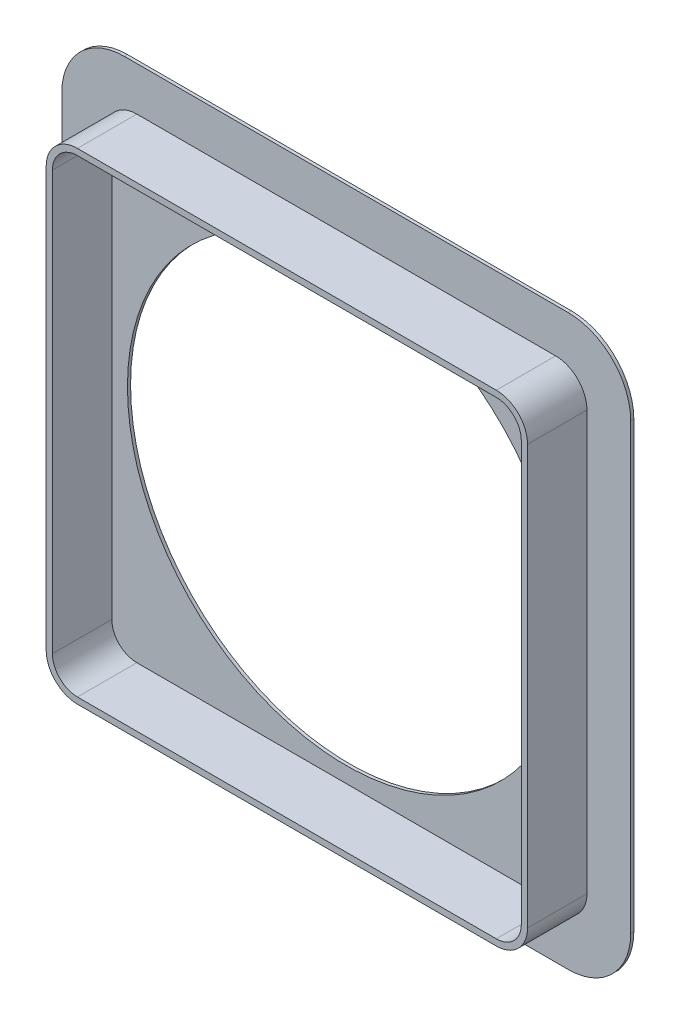
ISO-10303-21;
HEADER;
FILE_DESCRIPTION(('STEP AP214'),'2;1');
FILE_NAME('part.step','',(''),(''),'','','');
FILE_SCHEMA(('AUTOMOTIVE_DESIGN { 1 0 10303 214 1 1 1 1 }'));
ENDSEC;
DATA;
#1=APPLICATION_CONTEXT('core data for automotive mechanical design processes');
#2=APPLICATION_PROTOCOL_DEFINITION('international standard','automotive_design',2000,#1);
#3=PRODUCT_CONTEXT('',#1,'mechanical');
#4=PRODUCT('Part','Part','',(#3));
#5=PRODUCT_RELATED_PRODUCT_CATEGORY('part','',(#4));
#6=PRODUCT_DEFINITION_FORMATION('','',#4);
#7=PRODUCT_DEFINITION_CONTEXT('part definition',#1,'design');
#8=PRODUCT_DEFINITION('design','',#6,#7);
#9=PRODUCT_DEFINITION_SHAPE('','',#8);
#10=(LENGTH_UNIT() NAMED_UNIT(*) SI_UNIT(.MILLI.,.METRE.));
#11=(NAMED_UNIT(*) PLANE_ANGLE_UNIT() SI_UNIT($,.RADIAN.));
#12=(NAMED_UNIT(*) SI_UNIT($,.STERADIAN.) SOLID_ANGLE_UNIT());
#13=UNCERTAINTY_MEASURE_WITH_UNIT(LENGTH_MEASURE(1.E-05),#10,'distance_accuracy_value','');
#14=(GEOMETRIC_REPRESENTATION_CONTEXT(3) GLOBAL_UNCERTAINTY_ASSIGNED_CONTEXT((#13)) GLOBAL_UNIT_ASSIGNED_CONTEXT((#10,
#11,#12)) REPRESENTATION_CONTEXT('',''));
#15=CARTESIAN_POINT('',(0.,0.,0.));
#16=DIRECTION('',(0.,0.,1.));
#17=DIRECTION('',(1.,0.,0.));
#18=AXIS2_PLACEMENT_3D('',#15,#16,#17);
#19=CARTESIAN_POINT('',(-33.5,-33.5,0.));
#20=DIRECTION('',(0.,0.,1.));
#21=DIRECTION('',(1.,0.,0.));
#22=AXIS2_PLACEMENT_3D('',#19,#20,#21);
#23=CYLINDRICAL_SURFACE('',#22,4.);
#24=CARTESIAN_POINT('',(-33.5,-33.5,0.5));
#25=DIRECTION('',(0.,0.,-1.));
#26=DIRECTION('',(-1.,0.,0.));
#27=AXIS2_PLACEMENT_3D('',#24,#25,#26);
#28=CIRCLE('',#27,4.);
#29=CARTESIAN_POINT('',(-33.5,-37.5,0.5));
#30=VERTEX_POINT('',#29);
#31=CARTESIAN_POINT('',(-37.5,-33.5,0.5));
#32=VERTEX_POINT('',#31);
#33=EDGE_CURVE('E54',#30,#32,#28,.T.);
#34=ORIENTED_EDGE('',*,*,#33,.T.);
#35=DIRECTION('',(0.,0.,1.));
#36=VECTOR('',#35,1.);
#37=CARTESIAN_POINT('',(-37.5,-33.5,0.));
#38=LINE('',#37,#36);
#39=CARTESIAN_POINT('',(-37.5,-33.5,10.));
#40=VERTEX_POINT('',#39);
#41=EDGE_CURVE('E258',#32,#40,#38,.T.);
#42=ORIENTED_EDGE('',*,*,#41,.T.);
#43=CARTESIAN_POINT('',(-33.5,-33.5,10.));
#44=DIRECTION('',(0.,0.,1.));
#45=DIRECTION('',(1.,0.,0.));
#46=AXIS2_PLACEMENT_3D('',#43,#44,#45);
#47=CIRCLE('',#46,4.);
#48=CARTESIAN_POINT('',(-33.5,-37.5,10.));
#49=VERTEX_POINT('',#48);
#50=EDGE_CURVE('E237',#40,#49,#47,.T.);
#51=ORIENTED_EDGE('',*,*,#50,.T.);
#52=DIRECTION('',(0.,0.,1.));
#53=VECTOR('',#52,1.);
#54=CARTESIAN_POINT('',(-33.5,-37.5,0.));
#55=LINE('',#54,#53);
#56=EDGE_CURVE('E210',#30,#49,#55,.T.);
#57=ORIENTED_EDGE('',*,*,#56,.F.);
#58=EDGE_LOOP('',(#34,#42,#51,#57));
#59=FACE_BOUND('',#58,.T.);
#60=ADVANCED_FACE('F39',(#59),#23,.F.);
#61=CARTESIAN_POINT('',(-37.5,33.5,0.));
#62=DIRECTION('',(-1.,0.,0.));
#63=DIRECTION('',(0.,0.,1.));
#64=AXIS2_PLACEMENT_3D('',#61,#62,#63);
#65=PLANE('',#64);
#66=DIRECTION('',(0.,1.,0.));
#67=VECTOR('',#66,1.);
#68=CARTESIAN_POINT('',(-37.5,33.5,0.5));
#69=LINE('',#68,#67);
#70=CARTESIAN_POINT('',(-37.5,33.5,0.5));
#71=VERTEX_POINT('',#70);
#72=EDGE_CURVE('E61',#32,#71,#69,.T.);
#73=ORIENTED_EDGE('',*,*,#72,.T.);
#74=DIRECTION('',(0.,0.,1.));
#75=VECTOR('',#74,1.);
#76=CARTESIAN_POINT('',(-37.5,33.5,0.));
#77=LINE('',#76,#75);
#78=CARTESIAN_POINT('',(-37.5,33.5,10.));
#79=VERTEX_POINT('',#78);
#80=EDGE_CURVE('E261',#71,#79,#77,.T.);
#81=ORIENTED_EDGE('',*,*,#80,.T.);
#82=DIRECTION('',(0.,-1.,0.));
#83=VECTOR('',#82,1.);
#84=CARTESIAN_POINT('',(-37.5,33.5,10.));
#85=LINE('',#84,#83);
#86=EDGE_CURVE('E255',#79,#40,#85,.T.);
#87=ORIENTED_EDGE('',*,*,#86,.T.);
#88=ORIENTED_EDGE('',*,*,#41,.F.);
#89=EDGE_LOOP('',(#73,#81,#87,#88));
#90=FACE_BOUND('',#89,.T.);
#91=ADVANCED_FACE('F436',(#90),#65,.F.);
#92=CARTESIAN_POINT('',(-33.5,33.5,0.));
#93=DIRECTION('',(0.,0.,1.));
#94=DIRECTION('',(1.,0.,0.));
#95=AXIS2_PLACEMENT_3D('',#92,#93,#94);
#96=CYLINDRICAL_SURFACE('',#95,3.99999999999999);
#97=CARTESIAN_POINT('',(-33.5,33.5,0.5));
#98=DIRECTION('',(0.,0.,-1.));
#99=DIRECTION('',(-1.,0.,0.));
#100=AXIS2_PLACEMENT_3D('',#97,#98,#99);
#101=CIRCLE('',#100,3.99999999999999);
#102=CARTESIAN_POINT('',(-33.5,37.5,0.5));
#103=VERTEX_POINT('',#102);
#104=EDGE_CURVE('E231',#71,#103,#101,.T.);
#105=ORIENTED_EDGE('',*,*,#104,.T.);
#106=DIRECTION('',(0.,0.,1.));
#107=VECTOR('',#106,1.);
#108=CARTESIAN_POINT('',(-33.5,37.5,0.));
#109=LINE('',#108,#107);
#110=CARTESIAN_POINT('',(-33.5,37.5,10.));
#111=VERTEX_POINT('',#110);
#112=EDGE_CURVE('E263',#103,#111,#109,.T.);
#113=ORIENTED_EDGE('',*,*,#112,.T.);
#114=CARTESIAN_POINT('',(-33.5,33.5,10.));
#115=DIRECTION('',(0.,0.,1.));
#116=DIRECTION('',(1.,0.,0.));
#117=AXIS2_PLACEMENT_3D('',#114,#115,#116);
#118=CIRCLE('',#117,3.99999999999999);
#119=EDGE_CURVE('E252',#111,#79,#118,.T.);
#120=ORIENTED_EDGE('',*,*,#119,.T.);
#121=ORIENTED_EDGE('',*,*,#80,.F.);
#122=EDGE_LOOP('',(#105,#113,#120,#121));
#123=FACE_BOUND('',#122,.T.);
#124=ADVANCED_FACE('F441',(#123),#96,.F.);
#125=CARTESIAN_POINT('',(33.5,37.5,0.));
#126=DIRECTION('',(0.,1.,0.));
#127=DIRECTION('',(0.,0.,1.));
#128=AXIS2_PLACEMENT_3D('',#125,#126,#127);
#129=PLANE('',#128);
#130=DIRECTION('',(1.,0.,0.));
#131=VECTOR('',#130,1.);
#132=CARTESIAN_POINT('',(33.5,37.5,0.5));
#133=LINE('',#132,#131);
#134=CARTESIAN_POINT('',(33.5,37.5,0.5));
#135=VERTEX_POINT('',#134);
#136=EDGE_CURVE('E229',#103,#135,#133,.T.);
#137=ORIENTED_EDGE('',*,*,#136,.T.);
#138=DIRECTION('',(0.,0.,1.));
#139=VECTOR('',#138,1.);
#140=CARTESIAN_POINT('',(33.5,37.5,0.));
#141=LINE('',#140,#139);
#142=CARTESIAN_POINT('',(33.5,37.5,10.));
#143=VERTEX_POINT('',#142);
#144=EDGE_CURVE('E265',#135,#143,#141,.T.);
#145=ORIENTED_EDGE('',*,*,#144,.T.);
#146=DIRECTION('',(-1.,0.,0.));
#147=VECTOR('',#146,1.);
#148=CARTESIAN_POINT('',(33.5,37.5,10.));
#149=LINE('',#148,#147);
#150=EDGE_CURVE('E249',#143,#111,#149,.T.);
#151=ORIENTED_EDGE('',*,*,#150,.T.);
#152=ORIENTED_EDGE('',*,*,#112,.F.);
#153=EDGE_LOOP('',(#137,#145,#151,#152));
#154=FACE_BOUND('',#153,.T.);
#155=ADVANCED_FACE('F544',(#154),#129,.F.);
#156=CARTESIAN_POINT('',(33.5,33.5,0.));
#157=DIRECTION('',(0.,0.,1.));
#158=DIRECTION('',(1.,0.,0.));
#159=AXIS2_PLACEMENT_3D('',#156,#157,#158);
#160=CYLINDRICAL_SURFACE('',#159,3.99999999999999);
#161=CARTESIAN_POINT('',(33.5,33.5,0.5));
#162=DIRECTION('',(0.,0.,-1.));
#163=DIRECTION('',(-1.,0.,0.));
#164=AXIS2_PLACEMENT_3D('',#161,#162,#163);
#165=CIRCLE('',#164,3.99999999999999);
#166=CARTESIAN_POINT('',(37.5,33.5,0.5));
#167=VERTEX_POINT('',#166);
#168=EDGE_CURVE('E227',#135,#167,#165,.T.);
#169=ORIENTED_EDGE('',*,*,#168,.T.);
#170=DIRECTION('',(0.,0.,1.));
#171=VECTOR('',#170,1.);
#172=CARTESIAN_POINT('',(37.5,33.5,0.));
#173=LINE('',#172,#171);
#174=CARTESIAN_POINT('',(37.5,33.5,10.));
#175=VERTEX_POINT('',#174);
#176=EDGE_CURVE('E267',#167,#175,#173,.T.);
#177=ORIENTED_EDGE('',*,*,#176,.T.);
#178=CARTESIAN_POINT('',(33.5,33.5,10.));
#179=DIRECTION('',(0.,0.,1.));
#180=DIRECTION('',(1.,0.,0.));
#181=AXIS2_PLACEMENT_3D('',#178,#179,#180);
#182=CIRCLE('',#181,3.99999999999999);
#183=EDGE_CURVE('E246',#175,#143,#182,.T.);
#184=ORIENTED_EDGE('',*,*,#183,.T.);
#185=ORIENTED_EDGE('',*,*,#144,.F.);
#186=EDGE_LOOP('',(#169,#177,#184,#185));
#187=FACE_BOUND('',#186,.T.);
#188=ADVANCED_FACE('F534',(#187),#160,.F.);
#189=CARTESIAN_POINT('',(37.5,-33.5,0.));
#190=DIRECTION('',(1.,0.,0.));
#191=DIRECTION('',(0.,0.,-1.));
#192=AXIS2_PLACEMENT_3D('',#189,#190,#191);
#193=PLANE('',#192);
#194=DIRECTION('',(0.,-1.,0.));
#195=VECTOR('',#194,1.);
#196=CARTESIAN_POINT('',(37.5,-33.5,0.5));
#197=LINE('',#196,#195);
#198=CARTESIAN_POINT('',(37.5,-33.5,0.5));
#199=VERTEX_POINT('',#198);
#200=EDGE_CURVE('E218',#167,#199,#197,.T.);
#201=ORIENTED_EDGE('',*,*,#200,.T.);
#202=DIRECTION('',(0.,0.,1.));
#203=VECTOR('',#202,1.);
#204=CARTESIAN_POINT('',(37.5,-33.5,0.));
#205=LINE('',#204,#203);
#206=CARTESIAN_POINT('',(37.5,-33.5,10.));
#207=VERTEX_POINT('',#206);
#208=EDGE_CURVE('E209',#199,#207,#205,.T.);
#209=ORIENTED_EDGE('',*,*,#208,.T.);
#210=DIRECTION('',(0.,1.,0.));
#211=VECTOR('',#210,1.);
#212=CARTESIAN_POINT('',(37.5,-33.5,10.));
#213=LINE('',#212,#211);
#214=EDGE_CURVE('E243',#207,#175,#213,.T.);
#215=ORIENTED_EDGE('',*,*,#214,.T.);
#216=ORIENTED_EDGE('',*,*,#176,.F.);
#217=EDGE_LOOP('',(#201,#209,#215,#216));
#218=FACE_BOUND('',#217,.T.);
#219=ADVANCED_FACE('F526',(#218),#193,.F.);
#220=CARTESIAN_POINT('',(33.5,-33.5,0.));
#221=DIRECTION('',(0.,0.,1.));
#222=DIRECTION('',(1.,0.,0.));
#223=AXIS2_PLACEMENT_3D('',#220,#221,#222);
#224=CYLINDRICAL_SURFACE('',#223,4.);
#225=CARTESIAN_POINT('',(33.5,-33.5,0.5));
#226=DIRECTION('',(0.,0.,-1.));
#227=DIRECTION('',(-1.,0.,0.));
#228=AXIS2_PLACEMENT_3D('',#225,#226,#227);
#229=CIRCLE('',#228,4.);
#230=CARTESIAN_POINT('',(33.5,-37.5,0.5));
#231=VERTEX_POINT('',#230);
#232=EDGE_CURVE('E214',#199,#231,#229,.T.);
#233=ORIENTED_EDGE('',*,*,#232,.T.);
#234=DIRECTION('',(0.,0.,1.));
#235=VECTOR('',#234,1.);
#236=CARTESIAN_POINT('',(33.5,-37.5,0.));
#237=LINE('',#236,#235);
#238=CARTESIAN_POINT('',(33.5,-37.5,10.));
#239=VERTEX_POINT('',#238);
#240=EDGE_CURVE('E199',#231,#239,#237,.T.);
#241=ORIENTED_EDGE('',*,*,#240,.T.);
#242=CARTESIAN_POINT('',(33.5,-33.5,10.));
#243=DIRECTION('',(0.,0.,1.));
#244=DIRECTION('',(1.,0.,0.));
#245=AXIS2_PLACEMENT_3D('',#242,#243,#244);
#246=CIRCLE('',#245,4.);
#247=EDGE_CURVE('E241',#239,#207,#246,.T.);
#248=ORIENTED_EDGE('',*,*,#247,.T.);
#249=ORIENTED_EDGE('',*,*,#208,.F.);
#250=EDGE_LOOP('',(#233,#241,#248,#249));
#251=FACE_BOUND('',#250,.T.);
#252=ADVANCED_FACE('F215',(#251),#224,.F.);
#253=CARTESIAN_POINT('',(-33.5,-37.5,0.));
#254=DIRECTION('',(0.,-1.,0.));
#255=DIRECTION('',(0.,0.,-1.));
#256=AXIS2_PLACEMENT_3D('',#253,#254,#255);
#257=PLANE('',#256);
#258=DIRECTION('',(-1.,0.,0.));
#259=VECTOR('',#258,1.);
#260=CARTESIAN_POINT('',(-33.5,-37.5,0.5));
#261=LINE('',#260,#259);
#262=EDGE_CURVE('E203',#231,#30,#261,.T.);
#263=ORIENTED_EDGE('',*,*,#262,.T.);
#264=ORIENTED_EDGE('',*,*,#56,.T.);
#265=DIRECTION('',(1.,0.,0.));
#266=VECTOR('',#265,1.);
#267=CARTESIAN_POINT('',(-33.5,-37.5,10.));
#268=LINE('',#267,#266);
#269=EDGE_CURVE('E205',#49,#239,#268,.T.);
#270=ORIENTED_EDGE('',*,*,#269,.T.);
#271=ORIENTED_EDGE('',*,*,#240,.F.);
#272=EDGE_LOOP('',(#263,#264,#270,#271));
#273=FACE_BOUND('',#272,.T.);
#274=ADVANCED_FACE('F201',(#273),#257,.F.);
#275=CARTESIAN_POINT('',(0.,0.,0.5));
#276=DIRECTION('',(0.,0.,-1.));
#277=DIRECTION('',(-1.,0.,0.));
#278=AXIS2_PLACEMENT_3D('',#275,#276,#277);
#279=PLANE('',#278);
#280=DIRECTION('',(1.,0.,0.));
#281=VECTOR('',#280,1.);
#282=CARTESIAN_POINT('',(-45.5,-45.5,0.5));
#283=LINE('',#282,#281);
#284=CARTESIAN_POINT('',(-35.5,-45.5,0.5));
#285=VERTEX_POINT('',#284);
#286=CARTESIAN_POINT('',(35.5,-45.5,0.5));
#287=VERTEX_POINT('',#286);
#288=EDGE_CURVE('E305',#285,#287,#283,.T.);
#289=ORIENTED_EDGE('',*,*,#288,.T.);
#290=CARTESIAN_POINT('',(35.5,-35.5,0.5));
#291=DIRECTION('',(0.,0.,-1.));
#292=DIRECTION('',(-1.,0.,0.));
#293=AXIS2_PLACEMENT_3D('',#290,#291,#292);
#294=CIRCLE('',#293,10.);
#295=CARTESIAN_POINT('',(45.5,-35.5,0.5));
#296=VERTEX_POINT('',#295);
#297=EDGE_CURVE('E378',#287,#296,#294,.F.);
#298=ORIENTED_EDGE('',*,*,#297,.T.);
#299=DIRECTION('',(0.,1.,0.));
#300=VECTOR('',#299,1.);
#301=CARTESIAN_POINT('',(45.5,-45.5,0.5));
#302=LINE('',#301,#300);
#303=CARTESIAN_POINT('',(45.5,35.5,0.5));
#304=VERTEX_POINT('',#303);
#305=EDGE_CURVE('E295',#296,#304,#302,.T.);
#306=ORIENTED_EDGE('',*,*,#305,.T.);
#307=CARTESIAN_POINT('',(35.5,35.5,0.5));
#308=DIRECTION('',(0.,0.,-1.));
#309=DIRECTION('',(-1.,0.,0.));
#310=AXIS2_PLACEMENT_3D('',#307,#308,#309);
#311=CIRCLE('',#310,10.);
#312=CARTESIAN_POINT('',(35.5,45.5,0.5));
#313=VERTEX_POINT('',#312);
#314=EDGE_CURVE('E372',#304,#313,#311,.F.);
#315=ORIENTED_EDGE('',*,*,#314,.T.);
#316=DIRECTION('',(-1.,0.,0.));
#317=VECTOR('',#316,1.);
#318=CARTESIAN_POINT('',(-45.5,45.5,0.5));
#319=LINE('',#318,#317);
#320=CARTESIAN_POINT('',(-35.5,45.5,0.5));
#321=VERTEX_POINT('',#320);
#322=EDGE_CURVE('E298',#313,#321,#319,.T.);
#323=ORIENTED_EDGE('',*,*,#322,.T.);
#324=CARTESIAN_POINT('',(-35.5,35.5,0.5));
#325=DIRECTION('',(0.,0.,-1.));
#326=DIRECTION('',(-1.,0.,0.));
#327=AXIS2_PLACEMENT_3D('',#324,#325,#326);
#328=CIRCLE('',#327,10.);
#329=CARTESIAN_POINT('',(-45.5,35.5,0.5));
#330=VERTEX_POINT('',#329);
#331=EDGE_CURVE('E374',#321,#330,#328,.F.);
#332=ORIENTED_EDGE('',*,*,#331,.T.);
#333=DIRECTION('',(0.,-1.,0.));
#334=VECTOR('',#333,1.);
#335=CARTESIAN_POINT('',(-45.5,-45.5,0.5));
#336=LINE('',#335,#334);
#337=CARTESIAN_POINT('',(-45.5,-35.5,0.5));
#338=VERTEX_POINT('',#337);
#339=EDGE_CURVE('E302',#330,#338,#336,.T.);
#340=ORIENTED_EDGE('',*,*,#339,.T.);
#341=CARTESIAN_POINT('',(-35.5,-35.5,0.5));
#342=DIRECTION('',(0.,0.,-1.));
#343=DIRECTION('',(-1.,0.,0.));
#344=AXIS2_PLACEMENT_3D('',#341,#342,#343);
#345=CIRCLE('',#344,10.);
#346=EDGE_CURVE('E376',#338,#285,#345,.F.);
#347=ORIENTED_EDGE('',*,*,#346,.T.);
#348=EDGE_LOOP('',(#289,#298,#306,#315,#323,#332,#340,#347));
#349=FACE_BOUND('',#348,.T.);
#350=DIRECTION('',(0.,1.,0.));
#351=VECTOR('',#350,1.);
#352=CARTESIAN_POINT('',(38.5,0.,0.5));
#353=LINE('',#352,#351);
#354=CARTESIAN_POINT('',(38.5,-33.5,0.5));
#355=VERTEX_POINT('',#354);
#356=CARTESIAN_POINT('',(38.5,33.5,0.5));
#357=VERTEX_POINT('',#356);
#358=EDGE_CURVE('E291',#355,#357,#353,.T.);
#359=ORIENTED_EDGE('',*,*,#358,.F.);
#360=CARTESIAN_POINT('',(33.5,-33.5,0.5));
#361=DIRECTION('',(0.,0.,-1.));
#362=DIRECTION('',(-1.,0.,0.));
#363=AXIS2_PLACEMENT_3D('',#360,#361,#362);
#364=CIRCLE('',#363,5.);
#365=CARTESIAN_POINT('',(33.5,-38.5,0.5));
#366=VERTEX_POINT('',#365);
#367=EDGE_CURVE('E346',#355,#366,#364,.T.);
#368=ORIENTED_EDGE('',*,*,#367,.T.);
#369=DIRECTION('',(1.,0.,0.));
#370=VECTOR('',#369,1.);
#371=CARTESIAN_POINT('',(0.,-38.5,0.5));
#372=LINE('',#371,#370);
#373=CARTESIAN_POINT('',(-33.5,-38.5,0.5));
#374=VERTEX_POINT('',#373);
#375=EDGE_CURVE('E282',#374,#366,#372,.T.);
#376=ORIENTED_EDGE('',*,*,#375,.F.);
#377=CARTESIAN_POINT('',(-33.5,-33.5,0.5));
#378=DIRECTION('',(0.,0.,-1.));
#379=DIRECTION('',(-1.,0.,0.));
#380=AXIS2_PLACEMENT_3D('',#377,#378,#379);
#381=CIRCLE('',#380,5.);
#382=CARTESIAN_POINT('',(-38.5,-33.5,0.5));
#383=VERTEX_POINT('',#382);
#384=EDGE_CURVE('E348',#374,#383,#381,.T.);
#385=ORIENTED_EDGE('',*,*,#384,.T.);
#386=DIRECTION('',(0.,-1.,0.));
#387=VECTOR('',#386,1.);
#388=CARTESIAN_POINT('',(-38.5,0.,0.5));
#389=LINE('',#388,#387);
#390=CARTESIAN_POINT('',(-38.5,33.5,0.5));
#391=VERTEX_POINT('',#390);
#392=EDGE_CURVE('E285',#391,#383,#389,.T.);
#393=ORIENTED_EDGE('',*,*,#392,.F.);
#394=CARTESIAN_POINT('',(-33.5,33.5,0.5));
#395=DIRECTION('',(0.,0.,-1.));
#396=DIRECTION('',(-1.,0.,0.));
#397=AXIS2_PLACEMENT_3D('',#394,#395,#396);
#398=CIRCLE('',#397,5.);
#399=CARTESIAN_POINT('',(-33.5,38.5,0.5));
#400=VERTEX_POINT('',#399);
#401=EDGE_CURVE('E350',#391,#400,#398,.T.);
#402=ORIENTED_EDGE('',*,*,#401,.T.);
#403=DIRECTION('',(-1.,0.,0.));
#404=VECTOR('',#403,1.);
#405=CARTESIAN_POINT('',(0.,38.5,0.5));
#406=LINE('',#405,#404);
#407=CARTESIAN_POINT('',(33.5,38.5,0.5));
#408=VERTEX_POINT('',#407);
#409=EDGE_CURVE('E288',#408,#400,#406,.T.);
#410=ORIENTED_EDGE('',*,*,#409,.F.);
#411=CARTESIAN_POINT('',(33.5,33.5,0.5));
#412=DIRECTION('',(0.,0.,-1.));
#413=DIRECTION('',(-1.,0.,0.));
#414=AXIS2_PLACEMENT_3D('',#411,#412,#413);
#415=CIRCLE('',#414,5.);
#416=EDGE_CURVE('E352',#408,#357,#415,.T.);
#417=ORIENTED_EDGE('',*,*,#416,.T.);
#418=EDGE_LOOP('',(#359,#368,#376,#385,#393,#402,#410,#417));
#419=FACE_BOUND('',#418,.T.);
#420=ADVANCED_FACE('F408',(#349,#419),#279,.F.);
#421=CARTESIAN_POINT('',(45.5,-45.5,0.5));
#422=DIRECTION('',(-1.,0.,0.));
#423=DIRECTION('',(0.,0.,1.));
#424=AXIS2_PLACEMENT_3D('',#421,#422,#423);
#425=PLANE('',#424);
#426=ORIENTED_EDGE('',*,*,#305,.F.);
#427=DIRECTION('',(0.,0.,-1.));
#428=VECTOR('',#427,1.);
#429=CARTESIAN_POINT('',(45.5,-35.5,0.5));
#430=LINE('',#429,#428);
#431=CARTESIAN_POINT('',(45.5,-35.5,0.));
#432=VERTEX_POINT('',#431);
#433=EDGE_CURVE('E356',#296,#432,#430,.T.);
#434=ORIENTED_EDGE('',*,*,#433,.T.);
#435=DIRECTION('',(0.,1.,0.));
#436=VECTOR('',#435,1.);
#437=CARTESIAN_POINT('',(45.5,-45.5,0.));
#438=LINE('',#437,#436);
#439=CARTESIAN_POINT('',(45.5,35.5,0.));
#440=VERTEX_POINT('',#439);
#441=EDGE_CURVE('E294',#432,#440,#438,.T.);
#442=ORIENTED_EDGE('',*,*,#441,.T.);
#443=DIRECTION('',(0.,0.,-1.));
#444=VECTOR('',#443,1.);
#445=CARTESIAN_POINT('',(45.5,35.5,0.5));
#446=LINE('',#445,#444);
#447=EDGE_CURVE('E354',#440,#304,#446,.F.);
#448=ORIENTED_EDGE('',*,*,#447,.T.);
#449=EDGE_LOOP('',(#426,#434,#442,#448));
#450=FACE_BOUND('',#449,.T.);
#451=ADVANCED_FACE('F424',(#450),#425,.F.);
#452=CARTESIAN_POINT('',(-45.5,45.5,0.5));
#453=DIRECTION('',(0.,-1.,0.));
#454=DIRECTION('',(0.,0.,-1.));
#455=AXIS2_PLACEMENT_3D('',#452,#453,#454);
#456=PLANE('',#455);
#457=DIRECTION('',(-1.,0.,0.));
#458=VECTOR('',#457,1.);
#459=CARTESIAN_POINT('',(-45.5,45.5,0.));
#460=LINE('',#459,#458);
#461=CARTESIAN_POINT('',(35.5,45.5,0.));
#462=VERTEX_POINT('',#461);
#463=CARTESIAN_POINT('',(-35.5,45.5,0.));
#464=VERTEX_POINT('',#463);
#465=EDGE_CURVE('E311',#462,#464,#460,.T.);
#466=ORIENTED_EDGE('',*,*,#465,.T.);
#467=DIRECTION('',(0.,0.,-1.));
#468=VECTOR('',#467,1.);
#469=CARTESIAN_POINT('',(-35.5,45.5,0.5));
#470=LINE('',#469,#468);
#471=EDGE_CURVE('E11',#464,#321,#470,.F.);
#472=ORIENTED_EDGE('',*,*,#471,.T.);
#473=ORIENTED_EDGE('',*,*,#322,.F.);
#474=DIRECTION('',(0.,0.,-1.));
#475=VECTOR('',#474,1.);
#476=CARTESIAN_POINT('',(35.5,45.5,0.5));
#477=LINE('',#476,#475);
#478=EDGE_CURVE('E47',#313,#462,#477,.T.);
#479=ORIENTED_EDGE('',*,*,#478,.T.);
#480=EDGE_LOOP('',(#466,#472,#473,#479));
#481=FACE_BOUND('',#480,.T.);
#482=ADVANCED_FACE('F389',(#481),#456,.F.);
#483=CARTESIAN_POINT('',(-45.5,-45.5,0.5));
#484=DIRECTION('',(1.,0.,0.));
#485=DIRECTION('',(0.,0.,-1.));
#486=AXIS2_PLACEMENT_3D('',#483,#484,#485);
#487=PLANE('',#486);
#488=DIRECTION('',(0.,-1.,0.));
#489=VECTOR('',#488,1.);
#490=CARTESIAN_POINT('',(-45.5,-45.5,0.));
#491=LINE('',#490,#489);
#492=CARTESIAN_POINT('',(-45.5,35.5,0.));
#493=VERTEX_POINT('',#492);
#494=CARTESIAN_POINT('',(-45.5,-35.5,0.));
#495=VERTEX_POINT('',#494);
#496=EDGE_CURVE('E314',#493,#495,#491,.T.);
#497=ORIENTED_EDGE('',*,*,#496,.T.);
#498=DIRECTION('',(0.,0.,-1.));
#499=VECTOR('',#498,1.);
#500=CARTESIAN_POINT('',(-45.5,-35.5,0.5));
#501=LINE('',#500,#499);
#502=EDGE_CURVE('E383',#495,#338,#501,.F.);
#503=ORIENTED_EDGE('',*,*,#502,.T.);
#504=ORIENTED_EDGE('',*,*,#339,.F.);
#505=DIRECTION('',(0.,0.,-1.));
#506=VECTOR('',#505,1.);
#507=CARTESIAN_POINT('',(-45.5,35.5,0.5));
#508=LINE('',#507,#506);
#509=EDGE_CURVE('E380',#330,#493,#508,.T.);
#510=ORIENTED_EDGE('',*,*,#509,.T.);
#511=EDGE_LOOP('',(#497,#503,#504,#510));
#512=FACE_BOUND('',#511,.T.);
#513=ADVANCED_FACE('F404',(#512),#487,.F.);
#514=CARTESIAN_POINT('',(-45.5,-45.5,0.5));
#515=DIRECTION('',(0.,1.,0.));
#516=DIRECTION('',(0.,0.,1.));
#517=AXIS2_PLACEMENT_3D('',#514,#515,#516);
#518=PLANE('',#517);
#519=DIRECTION('',(1.,0.,0.));
#520=VECTOR('',#519,1.);
#521=CARTESIAN_POINT('',(-45.5,-45.5,0.));
#522=LINE('',#521,#520);
#523=CARTESIAN_POINT('',(-35.5,-45.5,0.));
#524=VERTEX_POINT('',#523);
#525=CARTESIAN_POINT('',(35.5,-45.5,0.));
#526=VERTEX_POINT('',#525);
#527=EDGE_CURVE('E299',#524,#526,#522,.T.);
#528=ORIENTED_EDGE('',*,*,#527,.T.);
#529=DIRECTION('',(0.,0.,-1.));
#530=VECTOR('',#529,1.);
#531=CARTESIAN_POINT('',(35.5,-45.5,0.5));
#532=LINE('',#531,#530);
#533=EDGE_CURVE('E370',#526,#287,#532,.F.);
#534=ORIENTED_EDGE('',*,*,#533,.T.);
#535=ORIENTED_EDGE('',*,*,#288,.F.);
#536=DIRECTION('',(0.,0.,-1.));
#537=VECTOR('',#536,1.);
#538=CARTESIAN_POINT('',(-35.5,-45.5,0.5));
#539=LINE('',#538,#537);
#540=EDGE_CURVE('E367',#285,#524,#539,.T.);
#541=ORIENTED_EDGE('',*,*,#540,.T.);
#542=EDGE_LOOP('',(#528,#534,#535,#541));
#543=FACE_BOUND('',#542,.T.);
#544=ADVANCED_FACE('F416',(#543),#518,.F.);
#545=CARTESIAN_POINT('',(0.,0.,0.));
#546=DIRECTION('',(0.,0.,-1.));
#547=DIRECTION('',(-1.,0.,0.));
#548=AXIS2_PLACEMENT_3D('',#545,#546,#547);
#549=PLANE('',#548);
#550=ORIENTED_EDGE('',*,*,#441,.F.);
#551=CARTESIAN_POINT('',(35.5,-35.5,0.));
#552=DIRECTION('',(0.,0.,-1.));
#553=DIRECTION('',(-1.,0.,0.));
#554=AXIS2_PLACEMENT_3D('',#551,#552,#553);
#555=CIRCLE('',#554,10.);
#556=EDGE_CURVE('E365',#432,#526,#555,.T.);
#557=ORIENTED_EDGE('',*,*,#556,.T.);
#558=ORIENTED_EDGE('',*,*,#527,.F.);
#559=CARTESIAN_POINT('',(-35.5,-35.5,0.));
#560=DIRECTION('',(0.,0.,-1.));
#561=DIRECTION('',(-1.,0.,0.));
#562=AXIS2_PLACEMENT_3D('',#559,#560,#561);
#563=CIRCLE('',#562,10.);
#564=EDGE_CURVE('E363',#524,#495,#563,.T.);
#565=ORIENTED_EDGE('',*,*,#564,.T.);
#566=ORIENTED_EDGE('',*,*,#496,.F.);
#567=CARTESIAN_POINT('',(-35.5,35.5,0.));
#568=DIRECTION('',(0.,0.,-1.));
#569=DIRECTION('',(-1.,0.,0.));
#570=AXIS2_PLACEMENT_3D('',#567,#568,#569);
#571=CIRCLE('',#570,10.);
#572=EDGE_CURVE('E361',#493,#464,#571,.T.);
#573=ORIENTED_EDGE('',*,*,#572,.T.);
#574=ORIENTED_EDGE('',*,*,#465,.F.);
#575=CARTESIAN_POINT('',(35.5,35.5,0.));
#576=DIRECTION('',(0.,0.,-1.));
#577=DIRECTION('',(-1.,0.,0.));
#578=AXIS2_PLACEMENT_3D('',#575,#576,#577);
#579=CIRCLE('',#578,10.);
#580=EDGE_CURVE('E359',#462,#440,#579,.T.);
#581=ORIENTED_EDGE('',*,*,#580,.T.);
#582=EDGE_LOOP('',(#550,#557,#558,#565,#566,#573,#574,#581));
#583=FACE_BOUND('',#582,.T.);
#584=CARTESIAN_POINT('',(0.,0.,0.));
#585=DIRECTION('',(0.,0.,1.));
#586=DIRECTION('',(1.,0.,0.));
#587=AXIS2_PLACEMENT_3D('',#584,#585,#586);
#588=CIRCLE('',#587,35.);
#589=CARTESIAN_POINT('',(35.,0.,0.));
#590=VERTEX_POINT('',#589);
#591=EDGE_CURVE('E222',#590,#590,#588,.T.);
#592=ORIENTED_EDGE('',*,*,#591,.T.);
#593=EDGE_LOOP('',(#592));
#594=FACE_BOUND('',#593,.T.);
#595=ADVANCED_FACE('F395',(#583,#594),#549,.T.);
#596=CARTESIAN_POINT('',(38.5,-38.5,10.));
#597=DIRECTION('',(-1.,0.,0.));
#598=DIRECTION('',(0.,0.,1.));
#599=AXIS2_PLACEMENT_3D('',#596,#597,#598);
#600=PLANE('',#599);
#601=DIRECTION('',(0.,1.,0.));
#602=VECTOR('',#601,1.);
#603=CARTESIAN_POINT('',(38.5,-38.5,10.));
#604=LINE('',#603,#602);
#605=CARTESIAN_POINT('',(38.5,-33.5,10.));
#606=VERTEX_POINT('',#605);
#607=CARTESIAN_POINT('',(38.5,33.5,10.));
#608=VERTEX_POINT('',#607);
#609=EDGE_CURVE('E260',#606,#608,#604,.T.);
#610=ORIENTED_EDGE('',*,*,#609,.F.);
#611=DIRECTION('',(0.,0.,-1.));
#612=VECTOR('',#611,1.);
#613=CARTESIAN_POINT('',(38.5,-33.5,10.));
#614=LINE('',#613,#612);
#615=EDGE_CURVE('E320',#606,#355,#614,.T.);
#616=ORIENTED_EDGE('',*,*,#615,.T.);
#617=ORIENTED_EDGE('',*,*,#358,.T.);
#618=DIRECTION('',(0.,0.,-1.));
#619=VECTOR('',#618,1.);
#620=CARTESIAN_POINT('',(38.5,33.5,10.));
#621=LINE('',#620,#619);
#622=EDGE_CURVE('E308',#357,#608,#621,.F.);
#623=ORIENTED_EDGE('',*,*,#622,.T.);
#624=EDGE_LOOP('',(#610,#616,#617,#623));
#625=FACE_BOUND('',#624,.T.);
#626=ADVANCED_FACE('F462',(#625),#600,.F.);
#627=CARTESIAN_POINT('',(-38.5,38.5,10.));
#628=DIRECTION('',(0.,-1.,0.));
#629=DIRECTION('',(0.,0.,-1.));
#630=AXIS2_PLACEMENT_3D('',#627,#628,#629);
#631=PLANE('',#630);
#632=ORIENTED_EDGE('',*,*,#409,.T.);
#633=DIRECTION('',(0.,0.,-1.));
#634=VECTOR('',#633,1.);
#635=CARTESIAN_POINT('',(-33.5,38.5,10.));
#636=LINE('',#635,#634);
#637=CARTESIAN_POINT('',(-33.5,38.5,10.));
#638=VERTEX_POINT('',#637);
#639=EDGE_CURVE('E344',#400,#638,#636,.F.);
#640=ORIENTED_EDGE('',*,*,#639,.T.);
#641=DIRECTION('',(-1.,0.,0.));
#642=VECTOR('',#641,1.);
#643=CARTESIAN_POINT('',(-38.5,38.5,10.));
#644=LINE('',#643,#642);
#645=CARTESIAN_POINT('',(33.5,38.5,10.));
#646=VERTEX_POINT('',#645);
#647=EDGE_CURVE('E273',#646,#638,#644,.T.);
#648=ORIENTED_EDGE('',*,*,#647,.F.);
#649=DIRECTION('',(0.,0.,-1.));
#650=VECTOR('',#649,1.);
#651=CARTESIAN_POINT('',(33.5,38.5,10.));
#652=LINE('',#651,#650);
#653=EDGE_CURVE('E341',#646,#408,#652,.T.);
#654=ORIENTED_EDGE('',*,*,#653,.T.);
#655=EDGE_LOOP('',(#632,#640,#648,#654));
#656=FACE_BOUND('',#655,.T.);
#657=ADVANCED_FACE('F458',(#656),#631,.F.);
#658=CARTESIAN_POINT('',(-38.5,-38.5,10.));
#659=DIRECTION('',(1.,0.,0.));
#660=DIRECTION('',(0.,0.,-1.));
#661=AXIS2_PLACEMENT_3D('',#658,#659,#660);
#662=PLANE('',#661);
#663=ORIENTED_EDGE('',*,*,#392,.T.);
#664=DIRECTION('',(0.,0.,-1.));
#665=VECTOR('',#664,1.);
#666=CARTESIAN_POINT('',(-38.5,-33.5,10.));
#667=LINE('',#666,#665);
#668=CARTESIAN_POINT('',(-38.5,-33.5,10.));
#669=VERTEX_POINT('',#668);
#670=EDGE_CURVE('E339',#383,#669,#667,.F.);
#671=ORIENTED_EDGE('',*,*,#670,.T.);
#672=DIRECTION('',(0.,-1.,0.));
#673=VECTOR('',#672,1.);
#674=CARTESIAN_POINT('',(-38.5,-38.5,10.));
#675=LINE('',#674,#673);
#676=CARTESIAN_POINT('',(-38.5,33.5,10.));
#677=VERTEX_POINT('',#676);
#678=EDGE_CURVE('E276',#677,#669,#675,.T.);
#679=ORIENTED_EDGE('',*,*,#678,.F.);
#680=DIRECTION('',(0.,0.,-1.));
#681=VECTOR('',#680,1.);
#682=CARTESIAN_POINT('',(-38.5,33.5,10.));
#683=LINE('',#682,#681);
#684=EDGE_CURVE('E336',#677,#391,#683,.T.);
#685=ORIENTED_EDGE('',*,*,#684,.T.);
#686=EDGE_LOOP('',(#663,#671,#679,#685));
#687=FACE_BOUND('',#686,.T.);
#688=ADVANCED_FACE('F454',(#687),#662,.F.);
#689=CARTESIAN_POINT('',(-38.5,-38.5,10.));
#690=DIRECTION('',(0.,1.,0.));
#691=DIRECTION('',(0.,0.,1.));
#692=AXIS2_PLACEMENT_3D('',#689,#690,#691);
#693=PLANE('',#692);
#694=ORIENTED_EDGE('',*,*,#375,.T.);
#695=DIRECTION('',(0.,0.,-1.));
#696=VECTOR('',#695,1.);
#697=CARTESIAN_POINT('',(33.5,-38.5,10.));
#698=LINE('',#697,#696);
#699=CARTESIAN_POINT('',(33.5,-38.5,10.));
#700=VERTEX_POINT('',#699);
#701=EDGE_CURVE('E326',#366,#700,#698,.F.);
#702=ORIENTED_EDGE('',*,*,#701,.T.);
#703=DIRECTION('',(1.,0.,0.));
#704=VECTOR('',#703,1.);
#705=CARTESIAN_POINT('',(-38.5,-38.5,10.));
#706=LINE('',#705,#704);
#707=CARTESIAN_POINT('',(-33.5,-38.5,10.));
#708=VERTEX_POINT('',#707);
#709=EDGE_CURVE('E279',#708,#700,#706,.T.);
#710=ORIENTED_EDGE('',*,*,#709,.F.);
#711=DIRECTION('',(0.,0.,-1.));
#712=VECTOR('',#711,1.);
#713=CARTESIAN_POINT('',(-33.5,-38.5,10.));
#714=LINE('',#713,#712);
#715=EDGE_CURVE('E323',#708,#374,#714,.T.);
#716=ORIENTED_EDGE('',*,*,#715,.T.);
#717=EDGE_LOOP('',(#694,#702,#710,#716));
#718=FACE_BOUND('',#717,.T.);
#719=ADVANCED_FACE('F450',(#718),#693,.F.);
#720=CARTESIAN_POINT('',(0.,0.,10.));
#721=DIRECTION('',(0.,0.,-1.));
#722=DIRECTION('',(-1.,0.,0.));
#723=AXIS2_PLACEMENT_3D('',#720,#721,#722);
#724=PLANE('',#723);
#725=ORIENTED_EDGE('',*,*,#269,.F.);
#726=ORIENTED_EDGE('',*,*,#50,.F.);
#727=ORIENTED_EDGE('',*,*,#86,.F.);
#728=ORIENTED_EDGE('',*,*,#119,.F.);
#729=ORIENTED_EDGE('',*,*,#150,.F.);
#730=ORIENTED_EDGE('',*,*,#183,.F.);
#731=ORIENTED_EDGE('',*,*,#214,.F.);
#732=ORIENTED_EDGE('',*,*,#247,.F.);
#733=EDGE_LOOP('',(#725,#726,#727,#728,#729,#730,#731,#732));
#734=FACE_BOUND('',#733,.T.);
#735=ORIENTED_EDGE('',*,*,#709,.T.);
#736=CARTESIAN_POINT('',(33.5,-33.5,10.));
#737=DIRECTION('',(0.,0.,-1.));
#738=DIRECTION('',(-1.,0.,0.));
#739=AXIS2_PLACEMENT_3D('',#736,#737,#738);
#740=CIRCLE('',#739,5.);
#741=EDGE_CURVE('E334',#700,#606,#740,.F.);
#742=ORIENTED_EDGE('',*,*,#741,.T.);
#743=ORIENTED_EDGE('',*,*,#609,.T.);
#744=CARTESIAN_POINT('',(33.5,33.5,10.));
#745=DIRECTION('',(0.,0.,-1.));
#746=DIRECTION('',(-1.,0.,0.));
#747=AXIS2_PLACEMENT_3D('',#744,#745,#746);
#748=CIRCLE('',#747,5.);
#749=EDGE_CURVE('E328',#608,#646,#748,.F.);
#750=ORIENTED_EDGE('',*,*,#749,.T.);
#751=ORIENTED_EDGE('',*,*,#647,.T.);
#752=CARTESIAN_POINT('',(-33.5,33.5,10.));
#753=DIRECTION('',(0.,0.,-1.));
#754=DIRECTION('',(-1.,0.,0.));
#755=AXIS2_PLACEMENT_3D('',#752,#753,#754);
#756=CIRCLE('',#755,5.);
#757=EDGE_CURVE('E330',#638,#677,#756,.F.);
#758=ORIENTED_EDGE('',*,*,#757,.T.);
#759=ORIENTED_EDGE('',*,*,#678,.T.);
#760=CARTESIAN_POINT('',(-33.5,-33.5,10.));
#761=DIRECTION('',(0.,0.,-1.));
#762=DIRECTION('',(-1.,0.,0.));
#763=AXIS2_PLACEMENT_3D('',#760,#761,#762);
#764=CIRCLE('',#763,5.);
#765=EDGE_CURVE('E332',#669,#708,#764,.F.);
#766=ORIENTED_EDGE('',*,*,#765,.T.);
#767=EDGE_LOOP('',(#735,#742,#743,#750,#751,#758,#759,#766));
#768=FACE_BOUND('',#767,.T.);
#769=ADVANCED_FACE('F446',(#734,#768),#724,.F.);
#770=CARTESIAN_POINT('',(33.5,-33.5,10.));
#771=DIRECTION('',(0.,0.,-1.));
#772=DIRECTION('',(-1.,0.,0.));
#773=AXIS2_PLACEMENT_3D('',#770,#771,#772);
#774=CYLINDRICAL_SURFACE('',#773,5.);
#775=ORIENTED_EDGE('',*,*,#741,.F.);
#776=ORIENTED_EDGE('',*,*,#701,.F.);
#777=ORIENTED_EDGE('',*,*,#367,.F.);
#778=ORIENTED_EDGE('',*,*,#615,.F.);
#779=EDGE_LOOP('',(#775,#776,#777,#778));
#780=FACE_BOUND('',#779,.T.);
#781=ADVANCED_FACE('F449',(#780),#774,.T.);
#782=CARTESIAN_POINT('',(-33.5,-33.5,10.));
#783=DIRECTION('',(0.,0.,-1.));
#784=DIRECTION('',(-1.,0.,0.));
#785=AXIS2_PLACEMENT_3D('',#782,#783,#784);
#786=CYLINDRICAL_SURFACE('',#785,5.);
#787=ORIENTED_EDGE('',*,*,#765,.F.);
#788=ORIENTED_EDGE('',*,*,#670,.F.);
#789=ORIENTED_EDGE('',*,*,#384,.F.);
#790=ORIENTED_EDGE('',*,*,#715,.F.);
#791=EDGE_LOOP('',(#787,#788,#789,#790));
#792=FACE_BOUND('',#791,.T.);
#793=ADVANCED_FACE('F481',(#792),#786,.T.);
#794=CARTESIAN_POINT('',(-33.5,33.5,10.));
#795=DIRECTION('',(0.,0.,-1.));
#796=DIRECTION('',(-1.,0.,0.));
#797=AXIS2_PLACEMENT_3D('',#794,#795,#796);
#798=CYLINDRICAL_SURFACE('',#797,5.);
#799=ORIENTED_EDGE('',*,*,#757,.F.);
#800=ORIENTED_EDGE('',*,*,#639,.F.);
#801=ORIENTED_EDGE('',*,*,#401,.F.);
#802=ORIENTED_EDGE('',*,*,#684,.F.);
#803=EDGE_LOOP('',(#799,#800,#801,#802));
#804=FACE_BOUND('',#803,.T.);
#805=ADVANCED_FACE('F485',(#804),#798,.T.);
#806=CARTESIAN_POINT('',(33.5,33.5,10.));
#807=DIRECTION('',(0.,0.,-1.));
#808=DIRECTION('',(-1.,0.,0.));
#809=AXIS2_PLACEMENT_3D('',#806,#807,#808);
#810=CYLINDRICAL_SURFACE('',#809,5.);
#811=ORIENTED_EDGE('',*,*,#749,.F.);
#812=ORIENTED_EDGE('',*,*,#622,.F.);
#813=ORIENTED_EDGE('',*,*,#416,.F.);
#814=ORIENTED_EDGE('',*,*,#653,.F.);
#815=EDGE_LOOP('',(#811,#812,#813,#814));
#816=FACE_BOUND('',#815,.T.);
#817=ADVANCED_FACE('F489',(#816),#810,.T.);
#818=CARTESIAN_POINT('',(35.5,-35.5,0.5));
#819=DIRECTION('',(0.,0.,-1.));
#820=DIRECTION('',(-1.,0.,0.));
#821=AXIS2_PLACEMENT_3D('',#818,#819,#820);
#822=CYLINDRICAL_SURFACE('',#821,10.);
#823=ORIENTED_EDGE('',*,*,#297,.F.);
#824=ORIENTED_EDGE('',*,*,#533,.F.);
#825=ORIENTED_EDGE('',*,*,#556,.F.);
#826=ORIENTED_EDGE('',*,*,#433,.F.);
#827=EDGE_LOOP('',(#823,#824,#825,#826));
#828=FACE_BOUND('',#827,.T.);
#829=ADVANCED_FACE('F421',(#828),#822,.T.);
#830=CARTESIAN_POINT('',(-35.5,-35.5,0.5));
#831=DIRECTION('',(0.,0.,-1.));
#832=DIRECTION('',(-1.,0.,0.));
#833=AXIS2_PLACEMENT_3D('',#830,#831,#832);
#834=CYLINDRICAL_SURFACE('',#833,10.);
#835=ORIENTED_EDGE('',*,*,#346,.F.);
#836=ORIENTED_EDGE('',*,*,#502,.F.);
#837=ORIENTED_EDGE('',*,*,#564,.F.);
#838=ORIENTED_EDGE('',*,*,#540,.F.);
#839=EDGE_LOOP('',(#835,#836,#837,#838));
#840=FACE_BOUND('',#839,.T.);
#841=ADVANCED_FACE('F413',(#840),#834,.T.);
#842=CARTESIAN_POINT('',(-35.5,35.5,0.5));
#843=DIRECTION('',(0.,0.,-1.));
#844=DIRECTION('',(-1.,0.,0.));
#845=AXIS2_PLACEMENT_3D('',#842,#843,#844);
#846=CYLINDRICAL_SURFACE('',#845,10.);
#847=ORIENTED_EDGE('',*,*,#331,.F.);
#848=ORIENTED_EDGE('',*,*,#471,.F.);
#849=ORIENTED_EDGE('',*,*,#572,.F.);
#850=ORIENTED_EDGE('',*,*,#509,.F.);
#851=EDGE_LOOP('',(#847,#848,#849,#850));
#852=FACE_BOUND('',#851,.T.);
#853=ADVANCED_FACE('F401',(#852),#846,.T.);
#854=CARTESIAN_POINT('',(35.5,35.5,0.5));
#855=DIRECTION('',(0.,0.,-1.));
#856=DIRECTION('',(-1.,0.,0.));
#857=AXIS2_PLACEMENT_3D('',#854,#855,#856);
#858=CYLINDRICAL_SURFACE('',#857,10.);
#859=ORIENTED_EDGE('',*,*,#314,.F.);
#860=ORIENTED_EDGE('',*,*,#447,.F.);
#861=ORIENTED_EDGE('',*,*,#580,.F.);
#862=ORIENTED_EDGE('',*,*,#478,.F.);
#863=EDGE_LOOP('',(#859,#860,#861,#862));
#864=FACE_BOUND('',#863,.T.);
#865=ADVANCED_FACE('F41',(#864),#858,.T.);
#866=CARTESIAN_POINT('',(0.,0.,106.566017177982));
#867=DIRECTION('',(0.,0.,-1.));
#868=DIRECTION('',(-1.,0.,0.));
#869=AXIS2_PLACEMENT_3D('',#866,#867,#868);
#870=CYLINDRICAL_SURFACE('',#869,35.);
#871=CARTESIAN_POINT('',(0.,0.,0.5));
#872=DIRECTION('',(0.,0.,-1.));
#873=DIRECTION('',(-1.,0.,0.));
#874=AXIS2_PLACEMENT_3D('',#871,#872,#873);
#875=CIRCLE('',#874,35.);
#876=CARTESIAN_POINT('',(-35.,0.,0.5));
#877=VERTEX_POINT('',#876);
#878=EDGE_CURVE('E234',#877,#877,#875,.T.);
#879=ORIENTED_EDGE('',*,*,#878,.F.);
#880=EDGE_LOOP('',(#879));
#881=FACE_BOUND('',#880,.T.);
#882=ORIENTED_EDGE('',*,*,#591,.F.);
#883=EDGE_LOOP('',(#882));
#884=FACE_BOUND('',#883,.T.);
#885=ADVANCED_FACE('F427',(#881,#884),#870,.F.);
#886=CARTESIAN_POINT('',(0.,0.,0.5));
#887=DIRECTION('',(0.,0.,-1.));
#888=DIRECTION('',(-1.,0.,0.));
#889=AXIS2_PLACEMENT_3D('',#886,#887,#888);
#890=PLANE('',#889);
#891=ORIENTED_EDGE('',*,*,#878,.T.);
#892=EDGE_LOOP('',(#891));
#893=FACE_BOUND('',#892,.T.);
#894=ORIENTED_EDGE('',*,*,#262,.F.);
#895=ORIENTED_EDGE('',*,*,#232,.F.);
#896=ORIENTED_EDGE('',*,*,#200,.F.);
#897=ORIENTED_EDGE('',*,*,#168,.F.);
#898=ORIENTED_EDGE('',*,*,#136,.F.);
#899=ORIENTED_EDGE('',*,*,#104,.F.);
#900=ORIENTED_EDGE('',*,*,#72,.F.);
#901=ORIENTED_EDGE('',*,*,#33,.F.);
#902=EDGE_LOOP('',(#894,#895,#896,#897,#898,#899,#900,#901));
#903=FACE_BOUND('',#902,.T.);
#904=ADVANCED_FACE('F220',(#893,#903),#890,.F.);
#905=CLOSED_SHELL('',(#60,#91,#124,#155,#188,#219,#252,#274,#420,#451,#482,#513,#544,#595,#626,
#657,#688,#719,#769,#781,#793,#805,#817,#829,#841,#853,#865,#885,#904));
#906=MANIFOLD_SOLID_BREP('B2',#905);
#907=ADVANCED_BREP_SHAPE_REPRESENTATION('',(#18,#906),#14);
#908=SHAPE_DEFINITION_REPRESENTATION(#9,#907);
ENDSEC;
END-ISO-10303-21;
